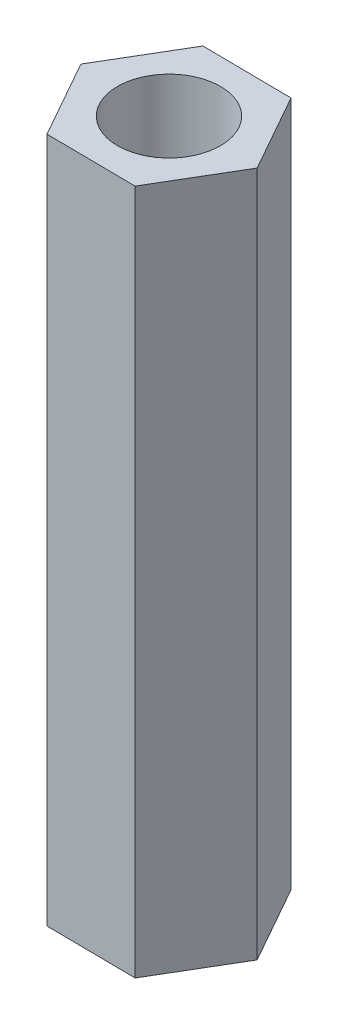
ISO-10303-21;
HEADER;
FILE_DESCRIPTION(('STEP AP214'),'2;1');
FILE_NAME('part.step','',(''),(''),'','','');
FILE_SCHEMA(('AUTOMOTIVE_DESIGN { 1 0 10303 214 1 1 1 1 }'));
ENDSEC;
DATA;
#1=APPLICATION_CONTEXT('core data for automotive mechanical design processes');
#2=APPLICATION_PROTOCOL_DEFINITION('international standard','automotive_design',2000,#1);
#3=PRODUCT_CONTEXT('',#1,'mechanical');
#4=PRODUCT('Part','Part','',(#3));
#5=PRODUCT_RELATED_PRODUCT_CATEGORY('part','',(#4));
#6=PRODUCT_DEFINITION_FORMATION('','',#4);
#7=PRODUCT_DEFINITION_CONTEXT('part definition',#1,'design');
#8=PRODUCT_DEFINITION('design','',#6,#7);
#9=PRODUCT_DEFINITION_SHAPE('','',#8);
#10=(LENGTH_UNIT() NAMED_UNIT(*) SI_UNIT(.MILLI.,.METRE.));
#11=(NAMED_UNIT(*) PLANE_ANGLE_UNIT() SI_UNIT($,.RADIAN.));
#12=(NAMED_UNIT(*) SI_UNIT($,.STERADIAN.) SOLID_ANGLE_UNIT());
#13=UNCERTAINTY_MEASURE_WITH_UNIT(LENGTH_MEASURE(1.E-05),#10,'distance_accuracy_value','');
#14=(GEOMETRIC_REPRESENTATION_CONTEXT(3) GLOBAL_UNCERTAINTY_ASSIGNED_CONTEXT((#13)) GLOBAL_UNIT_ASSIGNED_CONTEXT((#10,
#11,#12)) REPRESENTATION_CONTEXT('',''));
#15=CARTESIAN_POINT('',(0.,0.,0.));
#16=DIRECTION('',(0.,0.,1.));
#17=DIRECTION('',(1.,0.,0.));
#18=AXIS2_PLACEMENT_3D('',#15,#16,#17);
#19=CARTESIAN_POINT('',(-1.32279888179445,20.,2.23611339567638));
#20=DIRECTION('',(0.0105927369540521,0.,-0.999943895388047));
#21=DIRECTION('',(-0.999943895388047,0.,-0.0105927369540521));
#22=AXIS2_PLACEMENT_3D('',#19,#20,#21);
#23=PLANE('',#22);
#24=DIRECTION('',(0.999943895388047,0.,0.0105927369540521));
#25=VECTOR('',#24,1.);
#26=CARTESIAN_POINT('',(-1.32279888179445,0.,2.23611339567638));
#27=LINE('',#26,#25);
#28=CARTESIAN_POINT('',(-1.32279888179445,0.,2.23611339567638));
#29=VERTEX_POINT('',#28);
#30=CARTESIAN_POINT('',(1.27513156550121,0.,2.26363413356983));
#31=VERTEX_POINT('',#30);
#32=EDGE_CURVE('E121',#29,#31,#27,.T.);
#33=ORIENTED_EDGE('',*,*,#32,.T.);
#34=DIRECTION('',(0.,-1.,0.));
#35=VECTOR('',#34,1.);
#36=CARTESIAN_POINT('',(1.27513156550121,20.,2.26363413356983));
#37=LINE('',#36,#35);
#38=CARTESIAN_POINT('',(1.27513156550121,20.,2.26363413356983));
#39=VERTEX_POINT('',#38);
#40=EDGE_CURVE('E11',#39,#31,#37,.T.);
#41=ORIENTED_EDGE('',*,*,#40,.F.);
#42=DIRECTION('',(0.999943895388047,0.,0.0105927369540521));
#43=VECTOR('',#42,1.);
#44=CARTESIAN_POINT('',(-1.32279888179445,20.,2.23611339567638));
#45=LINE('',#44,#43);
#46=CARTESIAN_POINT('',(-1.32279888179445,20.,2.23611339567638));
#47=VERTEX_POINT('',#46);
#48=EDGE_CURVE('E132',#47,#39,#45,.T.);
#49=ORIENTED_EDGE('',*,*,#48,.F.);
#50=DIRECTION('',(0.,-1.,0.));
#51=VECTOR('',#50,1.);
#52=CARTESIAN_POINT('',(-1.32279888179445,20.,2.23611339567638));
#53=LINE('',#52,#51);
#54=EDGE_CURVE('E117',#47,#29,#53,.T.);
#55=ORIENTED_EDGE('',*,*,#54,.T.);
#56=EDGE_LOOP('',(#33,#41,#49,#55));
#57=FACE_BOUND('',#56,.T.);
#58=ADVANCED_FACE('F37',(#57),#23,.F.);
#59=CARTESIAN_POINT('',(1.27513156550121,20.,2.26363413356983));
#60=DIRECTION('',(-0.860680447288192,0.,-0.509145526991839));
#61=DIRECTION('',(-0.509145526991839,0.,0.860680447288192));
#62=AXIS2_PLACEMENT_3D('',#59,#60,#61);
#63=PLANE('',#62);
#64=DIRECTION('',(0.509145526991839,0.,-0.860680447288192));
#65=VECTOR('',#64,1.);
#66=CARTESIAN_POINT('',(1.27513156550121,0.,2.26363413356983));
#67=LINE('',#66,#65);
#68=CARTESIAN_POINT('',(2.59793044729565,0.,0.0275207378934452));
#69=VERTEX_POINT('',#68);
#70=EDGE_CURVE('E124',#31,#69,#67,.T.);
#71=ORIENTED_EDGE('',*,*,#70,.T.);
#72=DIRECTION('',(0.,-1.,0.));
#73=VECTOR('',#72,1.);
#74=CARTESIAN_POINT('',(2.59793044729565,20.,0.0275207378934452));
#75=LINE('',#74,#73);
#76=CARTESIAN_POINT('',(2.59793044729565,20.,0.0275207378934452));
#77=VERTEX_POINT('',#76);
#78=EDGE_CURVE('E45',#77,#69,#75,.T.);
#79=ORIENTED_EDGE('',*,*,#78,.F.);
#80=DIRECTION('',(0.509145526991839,0.,-0.860680447288192));
#81=VECTOR('',#80,1.);
#82=CARTESIAN_POINT('',(1.27513156550121,20.,2.26363413356983));
#83=LINE('',#82,#81);
#84=EDGE_CURVE('E90',#39,#77,#83,.T.);
#85=ORIENTED_EDGE('',*,*,#84,.F.);
#86=ORIENTED_EDGE('',*,*,#40,.T.);
#87=EDGE_LOOP('',(#71,#79,#85,#86));
#88=FACE_BOUND('',#87,.T.);
#89=ADVANCED_FACE('F157',(#88),#63,.F.);
#90=CARTESIAN_POINT('',(2.59793044729565,20.,0.0275207378934452));
#91=DIRECTION('',(-0.871273184242244,0.,0.490798368396209));
#92=DIRECTION('',(0.490798368396209,0.,0.871273184242244));
#93=AXIS2_PLACEMENT_3D('',#90,#91,#92);
#94=PLANE('',#93);
#95=DIRECTION('',(-0.490798368396209,0.,-0.871273184242244));
#96=VECTOR('',#95,1.);
#97=CARTESIAN_POINT('',(2.59793044729565,0.,0.0275207378934452));
#98=LINE('',#97,#96);
#99=CARTESIAN_POINT('',(1.32279888179444,0.,-2.23611339567639));
#100=VERTEX_POINT('',#99);
#101=EDGE_CURVE('E127',#69,#100,#98,.T.);
#102=ORIENTED_EDGE('',*,*,#101,.T.);
#103=DIRECTION('',(0.,-1.,0.));
#104=VECTOR('',#103,1.);
#105=CARTESIAN_POINT('',(1.32279888179444,20.,-2.23611339567639));
#106=LINE('',#105,#104);
#107=CARTESIAN_POINT('',(1.32279888179444,20.,-2.23611339567639));
#108=VERTEX_POINT('',#107);
#109=EDGE_CURVE('E112',#108,#100,#106,.T.);
#110=ORIENTED_EDGE('',*,*,#109,.F.);
#111=DIRECTION('',(-0.490798368396209,0.,-0.871273184242244));
#112=VECTOR('',#111,1.);
#113=CARTESIAN_POINT('',(2.59793044729565,20.,0.0275207378934452));
#114=LINE('',#113,#112);
#115=EDGE_CURVE('E103',#77,#108,#114,.T.);
#116=ORIENTED_EDGE('',*,*,#115,.F.);
#117=ORIENTED_EDGE('',*,*,#78,.T.);
#118=EDGE_LOOP('',(#102,#110,#116,#117));
#119=FACE_BOUND('',#118,.T.);
#120=ADVANCED_FACE('F138',(#119),#94,.F.);
#121=CARTESIAN_POINT('',(1.32279888179444,20.,-2.23611339567639));
#122=DIRECTION('',(-0.010592736954052,0.,0.999943895388047));
#123=DIRECTION('',(0.999943895388047,0.,0.010592736954052));
#124=AXIS2_PLACEMENT_3D('',#121,#122,#123);
#125=PLANE('',#124);
#126=DIRECTION('',(-0.999943895388047,0.,-0.010592736954052));
#127=VECTOR('',#126,1.);
#128=CARTESIAN_POINT('',(1.32279888179444,0.,-2.23611339567639));
#129=LINE('',#128,#127);
#130=CARTESIAN_POINT('',(-1.27513156550121,0.,-2.26363413356983));
#131=VERTEX_POINT('',#130);
#132=EDGE_CURVE('E111',#100,#131,#129,.T.);
#133=ORIENTED_EDGE('',*,*,#132,.T.);
#134=DIRECTION('',(0.,-1.,0.));
#135=VECTOR('',#134,1.);
#136=CARTESIAN_POINT('',(-1.27513156550121,20.,-2.26363413356983));
#137=LINE('',#136,#135);
#138=CARTESIAN_POINT('',(-1.27513156550121,20.,-2.26363413356983));
#139=VERTEX_POINT('',#138);
#140=EDGE_CURVE('E108',#139,#131,#137,.T.);
#141=ORIENTED_EDGE('',*,*,#140,.F.);
#142=DIRECTION('',(-0.999943895388047,0.,-0.010592736954052));
#143=VECTOR('',#142,1.);
#144=CARTESIAN_POINT('',(1.32279888179444,20.,-2.23611339567639));
#145=LINE('',#144,#143);
#146=EDGE_CURVE('E97',#108,#139,#145,.T.);
#147=ORIENTED_EDGE('',*,*,#146,.F.);
#148=ORIENTED_EDGE('',*,*,#109,.T.);
#149=EDGE_LOOP('',(#133,#141,#147,#148));
#150=FACE_BOUND('',#149,.T.);
#151=ADVANCED_FACE('F109',(#150),#125,.F.);
#152=CARTESIAN_POINT('',(-1.27513156550121,20.,-2.26363413356983));
#153=DIRECTION('',(0.860680447288192,0.,0.509145526991839));
#154=DIRECTION('',(0.509145526991839,0.,-0.860680447288192));
#155=AXIS2_PLACEMENT_3D('',#152,#153,#154);
#156=PLANE('',#155);
#157=DIRECTION('',(-0.509145526991839,0.,0.860680447288192));
#158=VECTOR('',#157,1.);
#159=CARTESIAN_POINT('',(-1.27513156550121,0.,-2.26363413356983));
#160=LINE('',#159,#158);
#161=CARTESIAN_POINT('',(-2.59793044729566,0.,-0.0275207378934456));
#162=VERTEX_POINT('',#161);
#163=EDGE_CURVE('E76',#131,#162,#160,.T.);
#164=ORIENTED_EDGE('',*,*,#163,.T.);
#165=DIRECTION('',(0.,-1.,0.));
#166=VECTOR('',#165,1.);
#167=CARTESIAN_POINT('',(-2.59793044729566,20.,-0.0275207378934456));
#168=LINE('',#167,#166);
#169=CARTESIAN_POINT('',(-2.59793044729566,20.,-0.0275207378934456));
#170=VERTEX_POINT('',#169);
#171=EDGE_CURVE('E113',#170,#162,#168,.T.);
#172=ORIENTED_EDGE('',*,*,#171,.F.);
#173=DIRECTION('',(-0.509145526991839,0.,0.860680447288192));
#174=VECTOR('',#173,1.);
#175=CARTESIAN_POINT('',(-1.27513156550121,20.,-2.26363413356983));
#176=LINE('',#175,#174);
#177=EDGE_CURVE('E101',#139,#170,#176,.T.);
#178=ORIENTED_EDGE('',*,*,#177,.F.);
#179=ORIENTED_EDGE('',*,*,#140,.T.);
#180=EDGE_LOOP('',(#164,#172,#178,#179));
#181=FACE_BOUND('',#180,.T.);
#182=ADVANCED_FACE('F115',(#181),#156,.F.);
#183=CARTESIAN_POINT('',(-2.59793044729566,20.,-0.0275207378934456));
#184=DIRECTION('',(0.871273184242244,0.,-0.490798368396208));
#185=DIRECTION('',(-0.490798368396208,0.,-0.871273184242244));
#186=AXIS2_PLACEMENT_3D('',#183,#184,#185);
#187=PLANE('',#186);
#188=DIRECTION('',(0.490798368396208,0.,0.871273184242244));
#189=VECTOR('',#188,1.);
#190=CARTESIAN_POINT('',(-2.59793044729566,0.,-0.0275207378934456));
#191=LINE('',#190,#189);
#192=EDGE_CURVE('E82',#162,#29,#191,.T.);
#193=ORIENTED_EDGE('',*,*,#192,.T.);
#194=ORIENTED_EDGE('',*,*,#54,.F.);
#195=DIRECTION('',(0.490798368396208,0.,0.871273184242244));
#196=VECTOR('',#195,1.);
#197=CARTESIAN_POINT('',(-2.59793044729566,20.,-0.0275207378934456));
#198=LINE('',#197,#196);
#199=EDGE_CURVE('E53',#170,#47,#198,.T.);
#200=ORIENTED_EDGE('',*,*,#199,.F.);
#201=ORIENTED_EDGE('',*,*,#171,.T.);
#202=EDGE_LOOP('',(#193,#194,#200,#201));
#203=FACE_BOUND('',#202,.T.);
#204=ADVANCED_FACE('F145',(#203),#187,.F.);
#205=CARTESIAN_POINT('',(0.,20.,0.));
#206=DIRECTION('',(0.,1.,0.));
#207=DIRECTION('',(0.,0.,1.));
#208=AXIS2_PLACEMENT_3D('',#205,#206,#207);
#209=PLANE('',#208);
#210=CARTESIAN_POINT('',(0.,20.,0.));
#211=DIRECTION('',(0.,1.,0.));
#212=DIRECTION('',(0.,0.,1.));
#213=AXIS2_PLACEMENT_3D('',#210,#211,#212);
#214=CIRCLE('',#213,1.5);
#215=CARTESIAN_POINT('',(0.,20.,1.5));
#216=VERTEX_POINT('',#215);
#217=EDGE_CURVE('E244',#216,#216,#214,.T.);
#218=ORIENTED_EDGE('',*,*,#217,.F.);
#219=EDGE_LOOP('',(#218));
#220=FACE_BOUND('',#219,.T.);
#221=ORIENTED_EDGE('',*,*,#48,.T.);
#222=ORIENTED_EDGE('',*,*,#84,.T.);
#223=ORIENTED_EDGE('',*,*,#115,.T.);
#224=ORIENTED_EDGE('',*,*,#146,.T.);
#225=ORIENTED_EDGE('',*,*,#177,.T.);
#226=ORIENTED_EDGE('',*,*,#199,.T.);
#227=EDGE_LOOP('',(#221,#222,#223,#224,#225,#226));
#228=FACE_BOUND('',#227,.T.);
#229=ADVANCED_FACE('F99',(#220,#228),#209,.T.);
#230=CARTESIAN_POINT('',(0.,0.,0.));
#231=DIRECTION('',(0.,1.,0.));
#232=DIRECTION('',(0.,0.,1.));
#233=AXIS2_PLACEMENT_3D('',#230,#231,#232);
#234=PLANE('',#233);
#235=CARTESIAN_POINT('',(0.,0.,0.));
#236=DIRECTION('',(0.,1.,0.));
#237=DIRECTION('',(0.,0.,1.));
#238=AXIS2_PLACEMENT_3D('',#235,#236,#237);
#239=CIRCLE('',#238,1.5);
#240=CARTESIAN_POINT('',(0.,0.,1.5));
#241=VERTEX_POINT('',#240);
#242=EDGE_CURVE('E125',#241,#241,#239,.F.);
#243=ORIENTED_EDGE('',*,*,#242,.F.);
#244=EDGE_LOOP('',(#243));
#245=FACE_BOUND('',#244,.T.);
#246=ORIENTED_EDGE('',*,*,#32,.F.);
#247=ORIENTED_EDGE('',*,*,#192,.F.);
#248=ORIENTED_EDGE('',*,*,#163,.F.);
#249=ORIENTED_EDGE('',*,*,#132,.F.);
#250=ORIENTED_EDGE('',*,*,#101,.F.);
#251=ORIENTED_EDGE('',*,*,#70,.F.);
#252=EDGE_LOOP('',(#246,#247,#248,#249,#250,#251));
#253=FACE_BOUND('',#252,.T.);
#254=ADVANCED_FACE('F141',(#245,#253),#234,.F.);
#255=CARTESIAN_POINT('',(0.,-4.24264068711928,0.));
#256=DIRECTION('',(0.,1.,0.));
#257=DIRECTION('',(0.,0.,1.));
#258=AXIS2_PLACEMENT_3D('',#255,#256,#257);
#259=CYLINDRICAL_SURFACE('',#258,1.5);
#260=CARTESIAN_POINT('',(0.,0.,1.5));
#261=CARTESIAN_POINT('',(0.,0.208333333333333,1.5));
#262=CARTESIAN_POINT('',(0.,0.416666666666666,1.5));
#263=CARTESIAN_POINT('',(0.,0.833333333333333,1.5));
#264=CARTESIAN_POINT('',(0.,1.04166666666667,1.5));
#265=CARTESIAN_POINT('',(0.,1.45833333333333,1.5));
#266=CARTESIAN_POINT('',(0.,1.66666666666667,1.5));
#267=CARTESIAN_POINT('',(0.,2.08333333333333,1.5));
#268=CARTESIAN_POINT('',(0.,2.29166666666667,1.5));
#269=CARTESIAN_POINT('',(0.,2.70833333333333,1.5));
#270=CARTESIAN_POINT('',(0.,2.91666666666667,1.5));
#271=CARTESIAN_POINT('',(0.,3.33333333333333,1.5));
#272=CARTESIAN_POINT('',(0.,3.54166666666667,1.5));
#273=CARTESIAN_POINT('',(0.,3.95833333333333,1.5));
#274=CARTESIAN_POINT('',(0.,4.16666666666667,1.5));
#275=CARTESIAN_POINT('',(0.,4.58333333333333,1.5));
#276=CARTESIAN_POINT('',(0.,4.79166666666667,1.5));
#277=CARTESIAN_POINT('',(0.,5.20833333333333,1.5));
#278=CARTESIAN_POINT('',(0.,5.41666666666667,1.5));
#279=CARTESIAN_POINT('',(0.,5.83333333333333,1.5));
#280=CARTESIAN_POINT('',(0.,6.04166666666667,1.5));
#281=CARTESIAN_POINT('',(0.,6.45833333333333,1.5));
#282=CARTESIAN_POINT('',(0.,6.66666666666667,1.5));
#283=CARTESIAN_POINT('',(0.,7.08333333333333,1.5));
#284=CARTESIAN_POINT('',(0.,7.29166666666667,1.5));
#285=CARTESIAN_POINT('',(0.,7.70833333333333,1.5));
#286=CARTESIAN_POINT('',(0.,7.91666666666667,1.5));
#287=CARTESIAN_POINT('',(0.,8.33333333333333,1.5));
#288=CARTESIAN_POINT('',(0.,8.54166666666667,1.5));
#289=CARTESIAN_POINT('',(0.,8.95833333333333,1.5));
#290=CARTESIAN_POINT('',(0.,9.16666666666667,1.5));
#291=CARTESIAN_POINT('',(0.,9.58333333333333,1.5));
#292=CARTESIAN_POINT('',(0.,9.79166666666667,1.5));
#293=CARTESIAN_POINT('',(0.,10.2083333333333,1.5));
#294=CARTESIAN_POINT('',(0.,10.4166666666667,1.5));
#295=CARTESIAN_POINT('',(0.,10.8333333333333,1.5));
#296=CARTESIAN_POINT('',(0.,11.0416666666667,1.5));
#297=CARTESIAN_POINT('',(0.,11.4583333333333,1.5));
#298=CARTESIAN_POINT('',(0.,11.6666666666667,1.5));
#299=CARTESIAN_POINT('',(0.,12.0833333333333,1.5));
#300=CARTESIAN_POINT('',(0.,12.2916666666667,1.5));
#301=CARTESIAN_POINT('',(0.,12.7083333333333,1.5));
#302=CARTESIAN_POINT('',(0.,12.9166666666667,1.5));
#303=CARTESIAN_POINT('',(0.,13.3333333333333,1.5));
#304=CARTESIAN_POINT('',(0.,13.5416666666667,1.5));
#305=CARTESIAN_POINT('',(0.,13.9583333333333,1.5));
#306=CARTESIAN_POINT('',(0.,14.1666666666667,1.5));
#307=CARTESIAN_POINT('',(0.,14.5833333333333,1.5));
#308=CARTESIAN_POINT('',(0.,14.7916666666667,1.5));
#309=CARTESIAN_POINT('',(0.,15.2083333333333,1.5));
#310=CARTESIAN_POINT('',(0.,15.4166666666667,1.5));
#311=CARTESIAN_POINT('',(0.,15.8333333333333,1.5));
#312=CARTESIAN_POINT('',(0.,16.0416666666667,1.5));
#313=CARTESIAN_POINT('',(0.,16.4583333333333,1.5));
#314=CARTESIAN_POINT('',(0.,16.6666666666667,1.5));
#315=CARTESIAN_POINT('',(0.,17.0833333333333,1.5));
#316=CARTESIAN_POINT('',(0.,17.2916666666667,1.5));
#317=CARTESIAN_POINT('',(0.,17.7083333333333,1.5));
#318=CARTESIAN_POINT('',(0.,17.9166666666667,1.5));
#319=CARTESIAN_POINT('',(0.,18.3333333333333,1.5));
#320=CARTESIAN_POINT('',(0.,18.5416666666667,1.5));
#321=CARTESIAN_POINT('',(0.,18.9583333333333,1.5));
#322=CARTESIAN_POINT('',(0.,19.1666666666667,1.5));
#323=CARTESIAN_POINT('',(0.,19.5833333333333,1.5));
#324=CARTESIAN_POINT('',(0.,19.7916666666667,1.5));
#325=CARTESIAN_POINT('',(0.,20.,1.5));
#326=B_SPLINE_CURVE_WITH_KNOTS('',3,(#260,#261,#262,#263,#264,#265,#266,#267,#268,#269,#270,
#271,#272,#273,#274,#275,#276,#277,#278,#279,#280,#281,#282,#283,#284,#285,#286,#287,#288,#289,
#290,#291,#292,#293,#294,#295,#296,#297,#298,#299,#300,#301,#302,#303,#304,#305,#306,#307,#308,
#309,#310,#311,#312,#313,#314,#315,#316,#317,#318,#319,#320,#321,#322,#323,#324,#325),
.UNSPECIFIED.,.F.,.F.,(4,2,2,2,2,2,2,2,2,2,2,2,2,2,2,2,2,2,2,2,2,2,2,2,2,2,2,2,2,2,2,2,4),(0.,
0.625000000000001,1.25,1.875,2.5,3.125,3.75,4.375,5.,5.625,6.25,6.875,7.5,8.125,8.75,9.375,10.,
10.625,11.25,11.875,12.5,13.125,13.75,14.375,15.,15.625,16.25,16.875,17.5,18.125,18.75,19.375,
20.),.UNSPECIFIED.);
#327=EDGE_CURVE('BSEAM197',#241,#216,#326,.T.);
#328=ORIENTED_EDGE('',*,*,#242,.T.);
#329=ORIENTED_EDGE('',*,*,#217,.T.);
#330=ORIENTED_EDGE('',*,*,#327,.T.);
#331=ORIENTED_EDGE('',*,*,#327,.F.);
#332=EDGE_LOOP('',(#328,#330,#329,#331));
#333=FACE_BOUND('',#332,.T.);
#334=ADVANCED_FACE('F197',(#333),#259,.F.);
#335=CLOSED_SHELL('',(#58,#89,#120,#151,#182,#204,#229,#254,#334));
#336=MANIFOLD_SOLID_BREP('B2',#335);
#337=ADVANCED_BREP_SHAPE_REPRESENTATION('',(#18,#336),#14);
#338=SHAPE_DEFINITION_REPRESENTATION(#9,#337);
ENDSEC;
END-ISO-10303-21;
